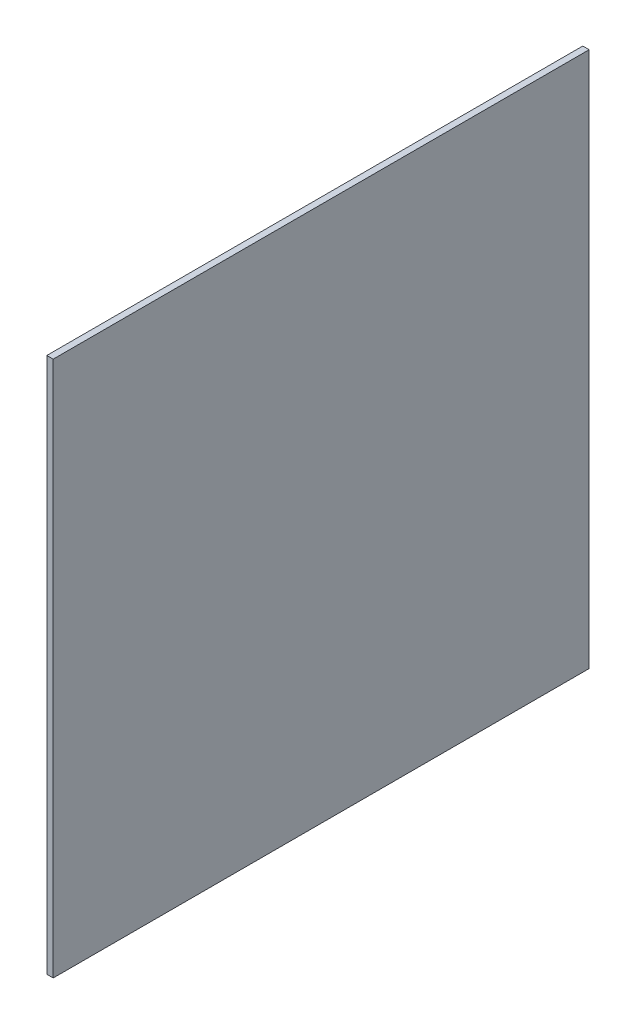
ISO-10303-21;
HEADER;
FILE_DESCRIPTION(('STEP AP214'),'2;1');
FILE_NAME('part.step','',(''),(''),'','','');
FILE_SCHEMA(('AUTOMOTIVE_DESIGN { 1 0 10303 214 1 1 1 1 }'));
ENDSEC;
DATA;
#1=APPLICATION_CONTEXT('core data for automotive mechanical design processes');
#2=APPLICATION_PROTOCOL_DEFINITION('international standard','automotive_design',2000,#1);
#3=PRODUCT_CONTEXT('',#1,'mechanical');
#4=PRODUCT('Part','Part','',(#3));
#5=PRODUCT_RELATED_PRODUCT_CATEGORY('part','',(#4));
#6=PRODUCT_DEFINITION_FORMATION('','',#4);
#7=PRODUCT_DEFINITION_CONTEXT('part definition',#1,'design');
#8=PRODUCT_DEFINITION('design','',#6,#7);
#9=PRODUCT_DEFINITION_SHAPE('','',#8);
#10=(LENGTH_UNIT() NAMED_UNIT(*) SI_UNIT(.MILLI.,.METRE.));
#11=(NAMED_UNIT(*) PLANE_ANGLE_UNIT() SI_UNIT($,.RADIAN.));
#12=(NAMED_UNIT(*) SI_UNIT($,.STERADIAN.) SOLID_ANGLE_UNIT());
#13=UNCERTAINTY_MEASURE_WITH_UNIT(LENGTH_MEASURE(1.E-05),#10,'distance_accuracy_value','');
#14=(GEOMETRIC_REPRESENTATION_CONTEXT(3) GLOBAL_UNCERTAINTY_ASSIGNED_CONTEXT((#13)) GLOBAL_UNIT_ASSIGNED_CONTEXT((#10,
#11,#12)) REPRESENTATION_CONTEXT('',''));
#15=CARTESIAN_POINT('',(0.,0.,0.));
#16=DIRECTION('',(0.,0.,1.));
#17=DIRECTION('',(1.,0.,0.));
#18=AXIS2_PLACEMENT_3D('',#15,#16,#17);
#19=CARTESIAN_POINT('',(1.5875,0.,0.));
#20=DIRECTION('',(0.,0.,-1.));
#21=DIRECTION('',(-1.,0.,0.));
#22=AXIS2_PLACEMENT_3D('',#19,#20,#21);
#23=PLANE('',#22);
#24=DIRECTION('',(0.,-1.,0.));
#25=VECTOR('',#24,1.);
#26=CARTESIAN_POINT('',(0.,0.,0.));
#27=LINE('',#26,#25);
#28=CARTESIAN_POINT('',(0.,133.35,0.));
#29=VERTEX_POINT('',#28);
#30=CARTESIAN_POINT('',(0.,0.,0.));
#31=VERTEX_POINT('',#30);
#32=EDGE_CURVE('E96',#29,#31,#27,.T.);
#33=ORIENTED_EDGE('',*,*,#32,.T.);
#34=DIRECTION('',(-1.,0.,0.));
#35=VECTOR('',#34,1.);
#36=CARTESIAN_POINT('',(1.5875,0.,0.));
#37=LINE('',#36,#35);
#38=CARTESIAN_POINT('',(1.5875,0.,0.));
#39=VERTEX_POINT('',#38);
#40=EDGE_CURVE('E11',#39,#31,#37,.T.);
#41=ORIENTED_EDGE('',*,*,#40,.F.);
#42=DIRECTION('',(0.,-1.,0.));
#43=VECTOR('',#42,1.);
#44=CARTESIAN_POINT('',(1.5875,0.,0.));
#45=LINE('',#44,#43);
#46=CARTESIAN_POINT('',(1.5875,133.35,0.));
#47=VERTEX_POINT('',#46);
#48=EDGE_CURVE('E84',#47,#39,#45,.T.);
#49=ORIENTED_EDGE('',*,*,#48,.F.);
#50=DIRECTION('',(-1.,0.,0.));
#51=VECTOR('',#50,1.);
#52=CARTESIAN_POINT('',(1.5875,133.35,0.));
#53=LINE('',#52,#51);
#54=EDGE_CURVE('E92',#47,#29,#53,.T.);
#55=ORIENTED_EDGE('',*,*,#54,.T.);
#56=EDGE_LOOP('',(#33,#41,#49,#55));
#57=FACE_BOUND('',#56,.T.);
#58=ADVANCED_FACE('F33',(#57),#23,.F.);
#59=CARTESIAN_POINT('',(1.5875,0.,0.));
#60=DIRECTION('',(0.,1.,0.));
#61=DIRECTION('',(0.,0.,1.));
#62=AXIS2_PLACEMENT_3D('',#59,#60,#61);
#63=PLANE('',#62);
#64=DIRECTION('',(0.,0.,-1.));
#65=VECTOR('',#64,1.);
#66=CARTESIAN_POINT('',(0.,0.,0.));
#67=LINE('',#66,#65);
#68=CARTESIAN_POINT('',(0.,0.,-133.35));
#69=VERTEX_POINT('',#68);
#70=EDGE_CURVE('E88',#31,#69,#67,.T.);
#71=ORIENTED_EDGE('',*,*,#70,.T.);
#72=DIRECTION('',(-1.,0.,0.));
#73=VECTOR('',#72,1.);
#74=CARTESIAN_POINT('',(1.5875,0.,-133.35));
#75=LINE('',#74,#73);
#76=CARTESIAN_POINT('',(1.5875,0.,-133.35));
#77=VERTEX_POINT('',#76);
#78=EDGE_CURVE('E41',#77,#69,#75,.T.);
#79=ORIENTED_EDGE('',*,*,#78,.F.);
#80=DIRECTION('',(0.,0.,-1.));
#81=VECTOR('',#80,1.);
#82=CARTESIAN_POINT('',(1.5875,0.,0.));
#83=LINE('',#82,#81);
#84=EDGE_CURVE('E79',#39,#77,#83,.T.);
#85=ORIENTED_EDGE('',*,*,#84,.F.);
#86=ORIENTED_EDGE('',*,*,#40,.T.);
#87=EDGE_LOOP('',(#71,#79,#85,#86));
#88=FACE_BOUND('',#87,.T.);
#89=ADVANCED_FACE('F87',(#88),#63,.F.);
#90=CARTESIAN_POINT('',(1.5875,0.,-133.35));
#91=DIRECTION('',(0.,0.,1.));
#92=DIRECTION('',(1.,0.,0.));
#93=AXIS2_PLACEMENT_3D('',#90,#91,#92);
#94=PLANE('',#93);
#95=DIRECTION('',(0.,1.,0.));
#96=VECTOR('',#95,1.);
#97=CARTESIAN_POINT('',(0.,0.,-133.35));
#98=LINE('',#97,#96);
#99=CARTESIAN_POINT('',(0.,133.35,-133.35));
#100=VERTEX_POINT('',#99);
#101=EDGE_CURVE('E66',#69,#100,#98,.T.);
#102=ORIENTED_EDGE('',*,*,#101,.T.);
#103=DIRECTION('',(-1.,0.,0.));
#104=VECTOR('',#103,1.);
#105=CARTESIAN_POINT('',(1.5875,133.35,-133.35));
#106=LINE('',#105,#104);
#107=CARTESIAN_POINT('',(1.5875,133.35,-133.35));
#108=VERTEX_POINT('',#107);
#109=EDGE_CURVE('E89',#108,#100,#106,.T.);
#110=ORIENTED_EDGE('',*,*,#109,.F.);
#111=DIRECTION('',(0.,1.,0.));
#112=VECTOR('',#111,1.);
#113=CARTESIAN_POINT('',(1.5875,0.,-133.35));
#114=LINE('',#113,#112);
#115=EDGE_CURVE('E82',#77,#108,#114,.T.);
#116=ORIENTED_EDGE('',*,*,#115,.F.);
#117=ORIENTED_EDGE('',*,*,#78,.T.);
#118=EDGE_LOOP('',(#102,#110,#116,#117));
#119=FACE_BOUND('',#118,.T.);
#120=ADVANCED_FACE('F90',(#119),#94,.F.);
#121=CARTESIAN_POINT('',(1.5875,133.35,0.));
#122=DIRECTION('',(0.,-1.,0.));
#123=DIRECTION('',(0.,0.,-1.));
#124=AXIS2_PLACEMENT_3D('',#121,#122,#123);
#125=PLANE('',#124);
#126=DIRECTION('',(0.,0.,1.));
#127=VECTOR('',#126,1.);
#128=CARTESIAN_POINT('',(0.,133.35,0.));
#129=LINE('',#128,#127);
#130=EDGE_CURVE('E72',#100,#29,#129,.T.);
#131=ORIENTED_EDGE('',*,*,#130,.T.);
#132=ORIENTED_EDGE('',*,*,#54,.F.);
#133=DIRECTION('',(0.,0.,1.));
#134=VECTOR('',#133,1.);
#135=CARTESIAN_POINT('',(1.5875,133.35,0.));
#136=LINE('',#135,#134);
#137=EDGE_CURVE('E49',#108,#47,#136,.T.);
#138=ORIENTED_EDGE('',*,*,#137,.F.);
#139=ORIENTED_EDGE('',*,*,#109,.T.);
#140=EDGE_LOOP('',(#131,#132,#138,#139));
#141=FACE_BOUND('',#140,.T.);
#142=ADVANCED_FACE('F103',(#141),#125,.F.);
#143=CARTESIAN_POINT('',(1.5875,0.,0.));
#144=DIRECTION('',(-1.,0.,0.));
#145=DIRECTION('',(0.,0.,1.));
#146=AXIS2_PLACEMENT_3D('',#143,#144,#145);
#147=PLANE('',#146);
#148=ORIENTED_EDGE('',*,*,#48,.T.);
#149=ORIENTED_EDGE('',*,*,#84,.T.);
#150=ORIENTED_EDGE('',*,*,#115,.T.);
#151=ORIENTED_EDGE('',*,*,#137,.T.);
#152=EDGE_LOOP('',(#148,#149,#150,#151));
#153=FACE_BOUND('',#152,.T.);
#154=ADVANCED_FACE('F80',(#153),#147,.F.);
#155=CARTESIAN_POINT('',(0.,0.,0.));
#156=DIRECTION('',(-1.,0.,0.));
#157=DIRECTION('',(0.,0.,1.));
#158=AXIS2_PLACEMENT_3D('',#155,#156,#157);
#159=PLANE('',#158);
#160=ORIENTED_EDGE('',*,*,#32,.F.);
#161=ORIENTED_EDGE('',*,*,#130,.F.);
#162=ORIENTED_EDGE('',*,*,#101,.F.);
#163=ORIENTED_EDGE('',*,*,#70,.F.);
#164=EDGE_LOOP('',(#160,#161,#162,#163));
#165=FACE_BOUND('',#164,.T.);
#166=ADVANCED_FACE('F106',(#165),#159,.T.);
#167=CLOSED_SHELL('',(#58,#89,#120,#142,#154,#166));
#168=MANIFOLD_SOLID_BREP('B2',#167);
#169=ADVANCED_BREP_SHAPE_REPRESENTATION('',(#18,#168),#14);
#170=SHAPE_DEFINITION_REPRESENTATION(#9,#169);
ENDSEC;
END-ISO-10303-21;
